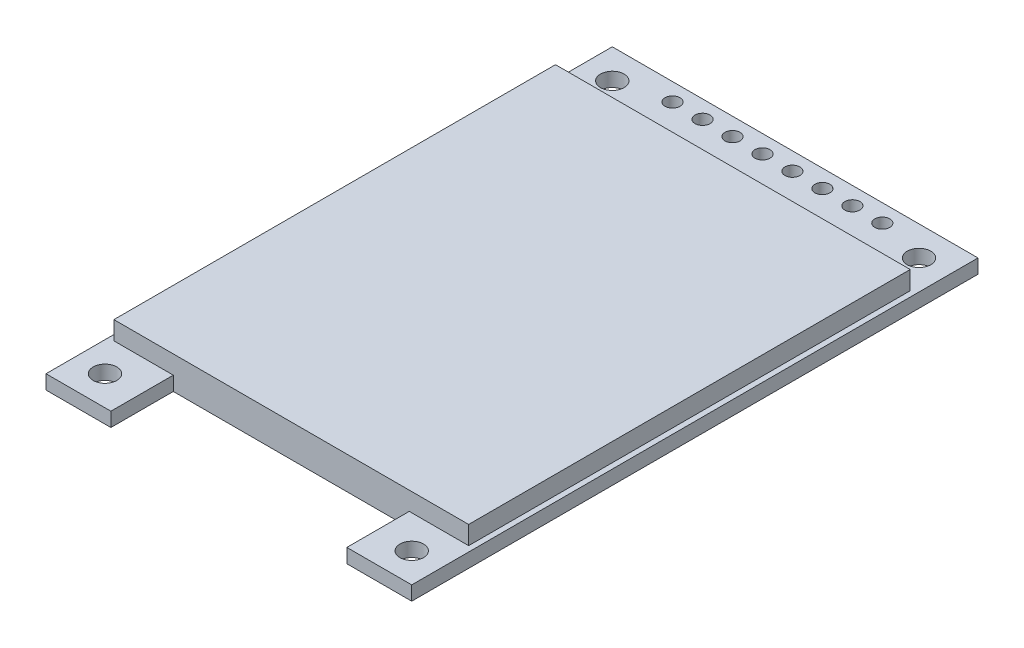
ISO-10303-21;
HEADER;
FILE_DESCRIPTION(('STEP AP214'),'2;1');
FILE_NAME('part.step','',(''),(''),'','','');
FILE_SCHEMA(('AUTOMOTIVE_DESIGN { 1 0 10303 214 1 1 1 1 }'));
ENDSEC;
DATA;
#1=APPLICATION_CONTEXT('core data for automotive mechanical design processes');
#2=APPLICATION_PROTOCOL_DEFINITION('international standard','automotive_design',2000,#1);
#3=PRODUCT_CONTEXT('',#1,'mechanical');
#4=PRODUCT('Part','Part','',(#3));
#5=PRODUCT_RELATED_PRODUCT_CATEGORY('part','',(#4));
#6=PRODUCT_DEFINITION_FORMATION('','',#4);
#7=PRODUCT_DEFINITION_CONTEXT('part definition',#1,'design');
#8=PRODUCT_DEFINITION('design','',#6,#7);
#9=PRODUCT_DEFINITION_SHAPE('','',#8);
#10=(LENGTH_UNIT() NAMED_UNIT(*) SI_UNIT(.MILLI.,.METRE.));
#11=(NAMED_UNIT(*) PLANE_ANGLE_UNIT() SI_UNIT($,.RADIAN.));
#12=(NAMED_UNIT(*) SI_UNIT($,.STERADIAN.) SOLID_ANGLE_UNIT());
#13=UNCERTAINTY_MEASURE_WITH_UNIT(LENGTH_MEASURE(1.E-05),#10,'distance_accuracy_value','');
#14=(GEOMETRIC_REPRESENTATION_CONTEXT(3) GLOBAL_UNCERTAINTY_ASSIGNED_CONTEXT((#13)) GLOBAL_UNIT_ASSIGNED_CONTEXT((#10,
#11,#12)) REPRESENTATION_CONTEXT('',''));
#15=CARTESIAN_POINT('',(0.,0.,0.));
#16=DIRECTION('',(0.,0.,1.));
#17=DIRECTION('',(1.,0.,0.));
#18=AXIS2_PLACEMENT_3D('',#15,#16,#17);
#19=CARTESIAN_POINT('',(0.,1.2,0.));
#20=DIRECTION('',(0.,0.,-1.));
#21=DIRECTION('',(-1.,0.,0.));
#22=AXIS2_PLACEMENT_3D('',#19,#20,#21);
#23=PLANE('',#22);
#24=DIRECTION('',(1.,0.,0.));
#25=VECTOR('',#24,1.);
#26=CARTESIAN_POINT('',(0.,0.,0.));
#27=LINE('',#26,#25);
#28=CARTESIAN_POINT('',(0.,0.,0.));
#29=VERTEX_POINT('',#28);
#30=CARTESIAN_POINT('',(5.5,0.,0.));
#31=VERTEX_POINT('',#30);
#32=EDGE_CURVE('E143',#29,#31,#27,.T.);
#33=ORIENTED_EDGE('',*,*,#32,.T.);
#34=DIRECTION('',(0.,1.,0.));
#35=VECTOR('',#34,1.);
#36=CARTESIAN_POINT('',(5.5,0.,0.));
#37=LINE('',#36,#35);
#38=CARTESIAN_POINT('',(5.5,1.2,0.));
#39=VERTEX_POINT('',#38);
#40=EDGE_CURVE('E126',#31,#39,#37,.T.);
#41=ORIENTED_EDGE('',*,*,#40,.T.);
#42=DIRECTION('',(1.,0.,0.));
#43=VECTOR('',#42,1.);
#44=CARTESIAN_POINT('',(0.,1.2,0.));
#45=LINE('',#44,#43);
#46=CARTESIAN_POINT('',(0.,1.2,0.));
#47=VERTEX_POINT('',#46);
#48=EDGE_CURVE('E251',#47,#39,#45,.T.);
#49=ORIENTED_EDGE('',*,*,#48,.F.);
#50=DIRECTION('',(0.,-1.,0.));
#51=VECTOR('',#50,1.);
#52=CARTESIAN_POINT('',(0.,1.2,0.));
#53=LINE('',#52,#51);
#54=EDGE_CURVE('E150',#47,#29,#53,.T.);
#55=ORIENTED_EDGE('',*,*,#54,.T.);
#56=EDGE_LOOP('',(#33,#41,#49,#55));
#57=FACE_BOUND('',#56,.T.);
#58=ADVANCED_FACE('F37',(#57),#23,.F.);
#59=CARTESIAN_POINT('',(24.39,0.,-46.5));
#60=DIRECTION('',(0.,1.,0.));
#61=DIRECTION('',(0.,0.,1.));
#62=AXIS2_PLACEMENT_3D('',#59,#60,#61);
#63=CYLINDRICAL_SURFACE('',#62,0.635000000000001);
#64=CARTESIAN_POINT('',(24.39,0.,-46.5));
#65=DIRECTION('',(0.,1.,0.));
#66=DIRECTION('',(0.,0.,1.));
#67=AXIS2_PLACEMENT_3D('',#64,#65,#66);
#68=CIRCLE('',#67,0.635000000000001);
#69=CARTESIAN_POINT('',(24.39,0.,-45.865));
#70=VERTEX_POINT('',#69);
#71=EDGE_CURVE('E45',#70,#70,#68,.T.);
#72=ORIENTED_EDGE('',*,*,#71,.F.);
#73=EDGE_LOOP('',(#72));
#74=FACE_BOUND('',#73,.T.);
#75=CARTESIAN_POINT('',(24.39,1.2,-46.5));
#76=DIRECTION('',(0.,1.,0.));
#77=DIRECTION('',(0.,0.,1.));
#78=AXIS2_PLACEMENT_3D('',#75,#76,#77);
#79=CIRCLE('',#78,0.635000000000001);
#80=CARTESIAN_POINT('',(24.39,1.2,-45.865));
#81=VERTEX_POINT('',#80);
#82=EDGE_CURVE('E11',#81,#81,#79,.T.);
#83=ORIENTED_EDGE('',*,*,#82,.T.);
#84=EDGE_LOOP('',(#83));
#85=FACE_BOUND('',#84,.T.);
#86=ADVANCED_FACE('F39',(#74,#85),#63,.F.);
#87=CARTESIAN_POINT('',(21.85,0.,-46.5));
#88=DIRECTION('',(0.,1.,0.));
#89=DIRECTION('',(0.,0.,1.));
#90=AXIS2_PLACEMENT_3D('',#87,#88,#89);
#91=CYLINDRICAL_SURFACE('',#90,0.635000000000001);
#92=CARTESIAN_POINT('',(21.85,0.,-46.5));
#93=DIRECTION('',(0.,1.,0.));
#94=DIRECTION('',(0.,0.,1.));
#95=AXIS2_PLACEMENT_3D('',#92,#93,#94);
#96=CIRCLE('',#95,0.635000000000001);
#97=CARTESIAN_POINT('',(21.85,0.,-45.865));
#98=VERTEX_POINT('',#97);
#99=EDGE_CURVE('E198',#98,#98,#96,.T.);
#100=ORIENTED_EDGE('',*,*,#99,.F.);
#101=EDGE_LOOP('',(#100));
#102=FACE_BOUND('',#101,.T.);
#103=CARTESIAN_POINT('',(21.85,1.2,-46.5));
#104=DIRECTION('',(0.,1.,0.));
#105=DIRECTION('',(0.,0.,1.));
#106=AXIS2_PLACEMENT_3D('',#103,#104,#105);
#107=CIRCLE('',#106,0.635000000000001);
#108=CARTESIAN_POINT('',(21.85,1.2,-45.865));
#109=VERTEX_POINT('',#108);
#110=EDGE_CURVE('E201',#109,#109,#107,.T.);
#111=ORIENTED_EDGE('',*,*,#110,.T.);
#112=EDGE_LOOP('',(#111));
#113=FACE_BOUND('',#112,.T.);
#114=ADVANCED_FACE('F209',(#102,#113),#91,.F.);
#115=CARTESIAN_POINT('',(19.31,0.,-46.5));
#116=DIRECTION('',(0.,1.,0.));
#117=DIRECTION('',(0.,0.,1.));
#118=AXIS2_PLACEMENT_3D('',#115,#116,#117);
#119=CYLINDRICAL_SURFACE('',#118,0.635000000000001);
#120=CARTESIAN_POINT('',(19.31,0.,-46.5));
#121=DIRECTION('',(0.,1.,0.));
#122=DIRECTION('',(0.,0.,1.));
#123=AXIS2_PLACEMENT_3D('',#120,#121,#122);
#124=CIRCLE('',#123,0.635000000000001);
#125=CARTESIAN_POINT('',(19.31,0.,-45.865));
#126=VERTEX_POINT('',#125);
#127=EDGE_CURVE('E192',#126,#126,#124,.T.);
#128=ORIENTED_EDGE('',*,*,#127,.F.);
#129=EDGE_LOOP('',(#128));
#130=FACE_BOUND('',#129,.T.);
#131=CARTESIAN_POINT('',(19.31,1.2,-46.5));
#132=DIRECTION('',(0.,1.,0.));
#133=DIRECTION('',(0.,0.,1.));
#134=AXIS2_PLACEMENT_3D('',#131,#132,#133);
#135=CIRCLE('',#134,0.635000000000001);
#136=CARTESIAN_POINT('',(19.31,1.2,-45.865));
#137=VERTEX_POINT('',#136);
#138=EDGE_CURVE('E195',#137,#137,#135,.T.);
#139=ORIENTED_EDGE('',*,*,#138,.T.);
#140=EDGE_LOOP('',(#139));
#141=FACE_BOUND('',#140,.T.);
#142=ADVANCED_FACE('F496',(#130,#141),#119,.F.);
#143=CARTESIAN_POINT('',(16.77,0.,-46.5));
#144=DIRECTION('',(0.,1.,0.));
#145=DIRECTION('',(0.,0.,1.));
#146=AXIS2_PLACEMENT_3D('',#143,#144,#145);
#147=CYLINDRICAL_SURFACE('',#146,0.635000000000001);
#148=CARTESIAN_POINT('',(16.77,0.,-46.5));
#149=DIRECTION('',(0.,1.,0.));
#150=DIRECTION('',(0.,0.,1.));
#151=AXIS2_PLACEMENT_3D('',#148,#149,#150);
#152=CIRCLE('',#151,0.635000000000001);
#153=CARTESIAN_POINT('',(16.77,0.,-45.865));
#154=VERTEX_POINT('',#153);
#155=EDGE_CURVE('E186',#154,#154,#152,.T.);
#156=ORIENTED_EDGE('',*,*,#155,.F.);
#157=EDGE_LOOP('',(#156));
#158=FACE_BOUND('',#157,.T.);
#159=CARTESIAN_POINT('',(16.77,1.2,-46.5));
#160=DIRECTION('',(0.,1.,0.));
#161=DIRECTION('',(0.,0.,1.));
#162=AXIS2_PLACEMENT_3D('',#159,#160,#161);
#163=CIRCLE('',#162,0.635000000000001);
#164=CARTESIAN_POINT('',(16.77,1.2,-45.865));
#165=VERTEX_POINT('',#164);
#166=EDGE_CURVE('E189',#165,#165,#163,.T.);
#167=ORIENTED_EDGE('',*,*,#166,.T.);
#168=EDGE_LOOP('',(#167));
#169=FACE_BOUND('',#168,.T.);
#170=ADVANCED_FACE('F487',(#158,#169),#147,.F.);
#171=CARTESIAN_POINT('',(14.23,0.,-46.5));
#172=DIRECTION('',(0.,1.,0.));
#173=DIRECTION('',(0.,0.,1.));
#174=AXIS2_PLACEMENT_3D('',#171,#172,#173);
#175=CYLINDRICAL_SURFACE('',#174,0.635000000000001);
#176=CARTESIAN_POINT('',(14.23,0.,-46.5));
#177=DIRECTION('',(0.,1.,0.));
#178=DIRECTION('',(0.,0.,1.));
#179=AXIS2_PLACEMENT_3D('',#176,#177,#178);
#180=CIRCLE('',#179,0.635000000000001);
#181=CARTESIAN_POINT('',(14.23,0.,-45.865));
#182=VERTEX_POINT('',#181);
#183=EDGE_CURVE('E180',#182,#182,#180,.T.);
#184=ORIENTED_EDGE('',*,*,#183,.F.);
#185=EDGE_LOOP('',(#184));
#186=FACE_BOUND('',#185,.T.);
#187=CARTESIAN_POINT('',(14.23,1.2,-46.5));
#188=DIRECTION('',(0.,1.,0.));
#189=DIRECTION('',(0.,0.,1.));
#190=AXIS2_PLACEMENT_3D('',#187,#188,#189);
#191=CIRCLE('',#190,0.635000000000001);
#192=CARTESIAN_POINT('',(14.23,1.2,-45.865));
#193=VERTEX_POINT('',#192);
#194=EDGE_CURVE('E183',#193,#193,#191,.T.);
#195=ORIENTED_EDGE('',*,*,#194,.T.);
#196=EDGE_LOOP('',(#195));
#197=FACE_BOUND('',#196,.T.);
#198=ADVANCED_FACE('F225',(#186,#197),#175,.F.);
#199=CARTESIAN_POINT('',(11.69,0.,-46.5));
#200=DIRECTION('',(0.,1.,0.));
#201=DIRECTION('',(0.,0.,1.));
#202=AXIS2_PLACEMENT_3D('',#199,#200,#201);
#203=CYLINDRICAL_SURFACE('',#202,0.635000000000001);
#204=CARTESIAN_POINT('',(11.69,0.,-46.5));
#205=DIRECTION('',(0.,1.,0.));
#206=DIRECTION('',(0.,0.,1.));
#207=AXIS2_PLACEMENT_3D('',#204,#205,#206);
#208=CIRCLE('',#207,0.635000000000001);
#209=CARTESIAN_POINT('',(11.69,0.,-45.865));
#210=VERTEX_POINT('',#209);
#211=EDGE_CURVE('E174',#210,#210,#208,.T.);
#212=ORIENTED_EDGE('',*,*,#211,.F.);
#213=EDGE_LOOP('',(#212));
#214=FACE_BOUND('',#213,.T.);
#215=CARTESIAN_POINT('',(11.69,1.2,-46.5));
#216=DIRECTION('',(0.,1.,0.));
#217=DIRECTION('',(0.,0.,1.));
#218=AXIS2_PLACEMENT_3D('',#215,#216,#217);
#219=CIRCLE('',#218,0.635000000000001);
#220=CARTESIAN_POINT('',(11.69,1.2,-45.865));
#221=VERTEX_POINT('',#220);
#222=EDGE_CURVE('E177',#221,#221,#219,.T.);
#223=ORIENTED_EDGE('',*,*,#222,.T.);
#224=EDGE_LOOP('',(#223));
#225=FACE_BOUND('',#224,.T.);
#226=ADVANCED_FACE('F215',(#214,#225),#203,.F.);
#227=CARTESIAN_POINT('',(0.,1.2,0.));
#228=DIRECTION('',(0.,-1.,0.));
#229=DIRECTION('',(0.,0.,-1.));
#230=AXIS2_PLACEMENT_3D('',#227,#228,#229);
#231=PLANE('',#230);
#232=CARTESIAN_POINT('',(28.5,1.2,-45.5));
#233=DIRECTION('',(0.,1.,0.));
#234=DIRECTION('',(0.,0.,1.));
#235=AXIS2_PLACEMENT_3D('',#232,#233,#234);
#236=CIRCLE('',#235,1.);
#237=CARTESIAN_POINT('',(28.5,1.2,-44.5));
#238=VERTEX_POINT('',#237);
#239=EDGE_CURVE('E324',#238,#238,#236,.T.);
#240=ORIENTED_EDGE('',*,*,#239,.F.);
#241=EDGE_LOOP('',(#240));
#242=FACE_BOUND('',#241,.T.);
#243=CARTESIAN_POINT('',(2.5,1.2,-2.5));
#244=DIRECTION('',(0.,1.,0.));
#245=DIRECTION('',(0.,0.,1.));
#246=AXIS2_PLACEMENT_3D('',#243,#244,#245);
#247=CIRCLE('',#246,1.);
#248=CARTESIAN_POINT('',(2.5,1.2,-1.5));
#249=VERTEX_POINT('',#248);
#250=EDGE_CURVE('E317',#249,#249,#247,.T.);
#251=ORIENTED_EDGE('',*,*,#250,.F.);
#252=EDGE_LOOP('',(#251));
#253=FACE_BOUND('',#252,.T.);
#254=CARTESIAN_POINT('',(28.5,1.2,-2.5));
#255=DIRECTION('',(0.,1.,0.));
#256=DIRECTION('',(0.,0.,1.));
#257=AXIS2_PLACEMENT_3D('',#254,#255,#256);
#258=CIRCLE('',#257,1.);
#259=CARTESIAN_POINT('',(28.5,1.2,-1.5));
#260=VERTEX_POINT('',#259);
#261=EDGE_CURVE('E334',#260,#260,#258,.T.);
#262=ORIENTED_EDGE('',*,*,#261,.F.);
#263=EDGE_LOOP('',(#262));
#264=FACE_BOUND('',#263,.T.);
#265=CARTESIAN_POINT('',(2.5,1.2,-45.5));
#266=DIRECTION('',(0.,1.,0.));
#267=DIRECTION('',(0.,0.,1.));
#268=AXIS2_PLACEMENT_3D('',#265,#266,#267);
#269=CIRCLE('',#268,1.);
#270=CARTESIAN_POINT('',(2.5,1.2,-44.5));
#271=VERTEX_POINT('',#270);
#272=EDGE_CURVE('E311',#271,#271,#269,.T.);
#273=ORIENTED_EDGE('',*,*,#272,.F.);
#274=EDGE_LOOP('',(#273));
#275=FACE_BOUND('',#274,.T.);
#276=CARTESIAN_POINT('',(9.15,1.2,-46.5));
#277=DIRECTION('',(0.,1.,0.));
#278=DIRECTION('',(0.,0.,1.));
#279=AXIS2_PLACEMENT_3D('',#276,#277,#278);
#280=CIRCLE('',#279,0.635000000000001);
#281=CARTESIAN_POINT('',(9.15,1.2,-45.865));
#282=VERTEX_POINT('',#281);
#283=EDGE_CURVE('E302',#282,#282,#280,.T.);
#284=ORIENTED_EDGE('',*,*,#283,.F.);
#285=EDGE_LOOP('',(#284));
#286=FACE_BOUND('',#285,.T.);
#287=CARTESIAN_POINT('',(6.61,1.2,-46.5));
#288=DIRECTION('',(0.,1.,0.));
#289=DIRECTION('',(0.,0.,1.));
#290=AXIS2_PLACEMENT_3D('',#287,#288,#289);
#291=CIRCLE('',#290,0.635000000000001);
#292=CARTESIAN_POINT('',(6.61,1.2,-45.865));
#293=VERTEX_POINT('',#292);
#294=EDGE_CURVE('E299',#293,#293,#291,.T.);
#295=ORIENTED_EDGE('',*,*,#294,.F.);
#296=EDGE_LOOP('',(#295));
#297=FACE_BOUND('',#296,.T.);
#298=ORIENTED_EDGE('',*,*,#48,.T.);
#299=DIRECTION('',(0.,0.,1.));
#300=VECTOR('',#299,1.);
#301=CARTESIAN_POINT('',(5.5,1.2,0.));
#302=LINE('',#301,#300);
#303=CARTESIAN_POINT('',(5.5,1.2,-5.29));
#304=VERTEX_POINT('',#303);
#305=EDGE_CURVE('E132',#304,#39,#302,.T.);
#306=ORIENTED_EDGE('',*,*,#305,.F.);
#307=DIRECTION('',(1.,0.,0.));
#308=VECTOR('',#307,1.);
#309=CARTESIAN_POINT('',(0.465000000000005,1.2,-5.29));
#310=LINE('',#309,#308);
#311=CARTESIAN_POINT('',(0.465000000000005,1.2,-5.29));
#312=VERTEX_POINT('',#311);
#313=EDGE_CURVE('E287',#312,#304,#310,.T.);
#314=ORIENTED_EDGE('',*,*,#313,.F.);
#315=DIRECTION('',(0.,0.,1.));
#316=VECTOR('',#315,1.);
#317=CARTESIAN_POINT('',(0.465000000000001,1.2,-42.72));
#318=LINE('',#317,#316);
#319=CARTESIAN_POINT('',(0.465000000000001,1.2,-42.72));
#320=VERTEX_POINT('',#319);
#321=EDGE_CURVE('E60',#320,#312,#318,.T.);
#322=ORIENTED_EDGE('',*,*,#321,.F.);
#323=DIRECTION('',(-1.,0.,0.));
#324=VECTOR('',#323,1.);
#325=CARTESIAN_POINT('',(0.465000000000001,1.2,-42.72));
#326=LINE('',#325,#324);
#327=CARTESIAN_POINT('',(30.535,1.2,-42.72));
#328=VERTEX_POINT('',#327);
#329=EDGE_CURVE('E281',#328,#320,#326,.T.);
#330=ORIENTED_EDGE('',*,*,#329,.F.);
#331=DIRECTION('',(0.,0.,-1.));
#332=VECTOR('',#331,1.);
#333=CARTESIAN_POINT('',(30.535,1.2,-42.72));
#334=LINE('',#333,#332);
#335=CARTESIAN_POINT('',(30.535,1.2,-5.29000000000001));
#336=VERTEX_POINT('',#335);
#337=EDGE_CURVE('E284',#336,#328,#334,.T.);
#338=ORIENTED_EDGE('',*,*,#337,.F.);
#339=CARTESIAN_POINT('',(25.5,1.2,-5.29000000000001));
#340=VERTEX_POINT('',#339);
#341=EDGE_CURVE('E289',#340,#336,#310,.T.);
#342=ORIENTED_EDGE('',*,*,#341,.F.);
#343=DIRECTION('',(0.,0.,-1.));
#344=VECTOR('',#343,1.);
#345=CARTESIAN_POINT('',(25.5,1.2,0.));
#346=LINE('',#345,#344);
#347=CARTESIAN_POINT('',(25.5,1.2,0.));
#348=VERTEX_POINT('',#347);
#349=EDGE_CURVE('E52',#348,#340,#346,.T.);
#350=ORIENTED_EDGE('',*,*,#349,.F.);
#351=CARTESIAN_POINT('',(31.,1.2,0.));
#352=VERTEX_POINT('',#351);
#353=EDGE_CURVE('E248',#348,#352,#45,.T.);
#354=ORIENTED_EDGE('',*,*,#353,.T.);
#355=DIRECTION('',(0.,0.,-1.));
#356=VECTOR('',#355,1.);
#357=CARTESIAN_POINT('',(31.,1.2,0.));
#358=LINE('',#357,#356);
#359=CARTESIAN_POINT('',(31.,1.2,-48.));
#360=VERTEX_POINT('',#359);
#361=EDGE_CURVE('E253',#352,#360,#358,.T.);
#362=ORIENTED_EDGE('',*,*,#361,.T.);
#363=DIRECTION('',(-1.,0.,0.));
#364=VECTOR('',#363,1.);
#365=CARTESIAN_POINT('',(0.,1.2,-48.));
#366=LINE('',#365,#364);
#367=CARTESIAN_POINT('',(0.,1.2,-48.));
#368=VERTEX_POINT('',#367);
#369=EDGE_CURVE('E167',#360,#368,#366,.T.);
#370=ORIENTED_EDGE('',*,*,#369,.T.);
#371=DIRECTION('',(0.,0.,1.));
#372=VECTOR('',#371,1.);
#373=CARTESIAN_POINT('',(0.,1.2,0.));
#374=LINE('',#373,#372);
#375=EDGE_CURVE('E162',#368,#47,#374,.T.);
#376=ORIENTED_EDGE('',*,*,#375,.T.);
#377=EDGE_LOOP('',(#298,#306,#314,#322,#330,#338,#342,#350,#354,#362,#370,#376));
#378=FACE_BOUND('',#377,.T.);
#379=ORIENTED_EDGE('',*,*,#222,.F.);
#380=EDGE_LOOP('',(#379));
#381=FACE_BOUND('',#380,.T.);
#382=ORIENTED_EDGE('',*,*,#194,.F.);
#383=EDGE_LOOP('',(#382));
#384=FACE_BOUND('',#383,.T.);
#385=ORIENTED_EDGE('',*,*,#166,.F.);
#386=EDGE_LOOP('',(#385));
#387=FACE_BOUND('',#386,.T.);
#388=ORIENTED_EDGE('',*,*,#138,.F.);
#389=EDGE_LOOP('',(#388));
#390=FACE_BOUND('',#389,.T.);
#391=ORIENTED_EDGE('',*,*,#110,.F.);
#392=EDGE_LOOP('',(#391));
#393=FACE_BOUND('',#392,.T.);
#394=ORIENTED_EDGE('',*,*,#82,.F.);
#395=EDGE_LOOP('',(#394));
#396=FACE_BOUND('',#395,.T.);
#397=ADVANCED_FACE('F212',(#242,#253,#264,#275,#286,#297,#378,#381,#384,#387,#390,#393,#396),
#231,.F.);
#398=CARTESIAN_POINT('',(0.,1.2,0.));
#399=DIRECTION('',(1.,0.,0.));
#400=DIRECTION('',(0.,0.,-1.));
#401=AXIS2_PLACEMENT_3D('',#398,#399,#400);
#402=PLANE('',#401);
#403=DIRECTION('',(0.,0.,1.));
#404=VECTOR('',#403,1.);
#405=CARTESIAN_POINT('',(0.,0.,0.));
#406=LINE('',#405,#404);
#407=CARTESIAN_POINT('',(0.,0.,-48.));
#408=VERTEX_POINT('',#407);
#409=EDGE_CURVE('E157',#408,#29,#406,.T.);
#410=ORIENTED_EDGE('',*,*,#409,.T.);
#411=ORIENTED_EDGE('',*,*,#54,.F.);
#412=ORIENTED_EDGE('',*,*,#375,.F.);
#413=DIRECTION('',(0.,-1.,0.));
#414=VECTOR('',#413,1.);
#415=CARTESIAN_POINT('',(0.,1.2,-48.));
#416=LINE('',#415,#414);
#417=EDGE_CURVE('E163',#368,#408,#416,.T.);
#418=ORIENTED_EDGE('',*,*,#417,.T.);
#419=EDGE_LOOP('',(#410,#411,#412,#418));
#420=FACE_BOUND('',#419,.T.);
#421=ADVANCED_FACE('F214',(#420),#402,.F.);
#422=ORIENTED_EDGE('',*,*,#353,.F.);
#423=DIRECTION('',(0.,1.,0.));
#424=VECTOR('',#423,1.);
#425=CARTESIAN_POINT('',(25.5,0.,0.));
#426=LINE('',#425,#424);
#427=CARTESIAN_POINT('',(25.5,0.,0.));
#428=VERTEX_POINT('',#427);
#429=EDGE_CURVE('E136',#428,#348,#426,.T.);
#430=ORIENTED_EDGE('',*,*,#429,.F.);
#431=CARTESIAN_POINT('',(31.,0.,0.));
#432=VERTEX_POINT('',#431);
#433=EDGE_CURVE('E153',#428,#432,#27,.T.);
#434=ORIENTED_EDGE('',*,*,#433,.T.);
#435=DIRECTION('',(0.,-1.,0.));
#436=VECTOR('',#435,1.);
#437=CARTESIAN_POINT('',(31.,1.2,0.));
#438=LINE('',#437,#436);
#439=EDGE_CURVE('E170',#352,#432,#438,.T.);
#440=ORIENTED_EDGE('',*,*,#439,.F.);
#441=EDGE_LOOP('',(#422,#430,#434,#440));
#442=FACE_BOUND('',#441,.T.);
#443=ADVANCED_FACE('F222',(#442),#23,.F.);
#444=CARTESIAN_POINT('',(31.,1.2,0.));
#445=DIRECTION('',(-1.,0.,0.));
#446=DIRECTION('',(0.,0.,1.));
#447=AXIS2_PLACEMENT_3D('',#444,#445,#446);
#448=PLANE('',#447);
#449=DIRECTION('',(0.,0.,-1.));
#450=VECTOR('',#449,1.);
#451=CARTESIAN_POINT('',(31.,0.,0.));
#452=LINE('',#451,#450);
#453=CARTESIAN_POINT('',(31.,0.,-48.));
#454=VERTEX_POINT('',#453);
#455=EDGE_CURVE('E152',#432,#454,#452,.T.);
#456=ORIENTED_EDGE('',*,*,#455,.T.);
#457=DIRECTION('',(0.,-1.,0.));
#458=VECTOR('',#457,1.);
#459=CARTESIAN_POINT('',(31.,1.2,-48.));
#460=LINE('',#459,#458);
#461=EDGE_CURVE('E166',#360,#454,#460,.T.);
#462=ORIENTED_EDGE('',*,*,#461,.F.);
#463=ORIENTED_EDGE('',*,*,#361,.F.);
#464=ORIENTED_EDGE('',*,*,#439,.T.);
#465=EDGE_LOOP('',(#456,#462,#463,#464));
#466=FACE_BOUND('',#465,.T.);
#467=ADVANCED_FACE('F238',(#466),#448,.F.);
#468=CARTESIAN_POINT('',(0.,1.2,-48.));
#469=DIRECTION('',(0.,0.,1.));
#470=DIRECTION('',(1.,0.,0.));
#471=AXIS2_PLACEMENT_3D('',#468,#469,#470);
#472=PLANE('',#471);
#473=DIRECTION('',(-1.,0.,0.));
#474=VECTOR('',#473,1.);
#475=CARTESIAN_POINT('',(0.,0.,-48.));
#476=LINE('',#475,#474);
#477=EDGE_CURVE('E155',#454,#408,#476,.T.);
#478=ORIENTED_EDGE('',*,*,#477,.T.);
#479=ORIENTED_EDGE('',*,*,#417,.F.);
#480=ORIENTED_EDGE('',*,*,#369,.F.);
#481=ORIENTED_EDGE('',*,*,#461,.T.);
#482=EDGE_LOOP('',(#478,#479,#480,#481));
#483=FACE_BOUND('',#482,.T.);
#484=ADVANCED_FACE('F243',(#483),#472,.F.);
#485=CARTESIAN_POINT('',(0.,0.,0.));
#486=DIRECTION('',(0.,-1.,0.));
#487=DIRECTION('',(0.,0.,-1.));
#488=AXIS2_PLACEMENT_3D('',#485,#486,#487);
#489=PLANE('',#488);
#490=CARTESIAN_POINT('',(28.5,0.,-45.5));
#491=DIRECTION('',(0.,1.,0.));
#492=DIRECTION('',(0.,0.,1.));
#493=AXIS2_PLACEMENT_3D('',#490,#491,#492);
#494=CIRCLE('',#493,1.);
#495=CARTESIAN_POINT('',(28.5,0.,-44.5));
#496=VERTEX_POINT('',#495);
#497=EDGE_CURVE('E314',#496,#496,#494,.T.);
#498=ORIENTED_EDGE('',*,*,#497,.T.);
#499=EDGE_LOOP('',(#498));
#500=FACE_BOUND('',#499,.T.);
#501=CARTESIAN_POINT('',(2.5,0.,-2.5));
#502=DIRECTION('',(0.,1.,0.));
#503=DIRECTION('',(0.,0.,1.));
#504=AXIS2_PLACEMENT_3D('',#501,#502,#503);
#505=CIRCLE('',#504,1.);
#506=CARTESIAN_POINT('',(2.5,0.,-1.5));
#507=VERTEX_POINT('',#506);
#508=EDGE_CURVE('E320',#507,#507,#505,.T.);
#509=ORIENTED_EDGE('',*,*,#508,.T.);
#510=EDGE_LOOP('',(#509));
#511=FACE_BOUND('',#510,.T.);
#512=CARTESIAN_POINT('',(28.5,0.,-2.5));
#513=DIRECTION('',(0.,1.,0.));
#514=DIRECTION('',(0.,0.,1.));
#515=AXIS2_PLACEMENT_3D('',#512,#513,#514);
#516=CIRCLE('',#515,1.);
#517=CARTESIAN_POINT('',(28.5,0.,-1.5));
#518=VERTEX_POINT('',#517);
#519=EDGE_CURVE('E321',#518,#518,#516,.T.);
#520=ORIENTED_EDGE('',*,*,#519,.T.);
#521=EDGE_LOOP('',(#520));
#522=FACE_BOUND('',#521,.T.);
#523=DIRECTION('',(0.,0.,1.));
#524=VECTOR('',#523,1.);
#525=CARTESIAN_POINT('',(5.5,0.,0.));
#526=LINE('',#525,#524);
#527=CARTESIAN_POINT('',(5.5,0.,-5.29));
#528=VERTEX_POINT('',#527);
#529=EDGE_CURVE('E129',#528,#31,#526,.T.);
#530=ORIENTED_EDGE('',*,*,#529,.T.);
#531=ORIENTED_EDGE('',*,*,#32,.F.);
#532=ORIENTED_EDGE('',*,*,#409,.F.);
#533=ORIENTED_EDGE('',*,*,#477,.F.);
#534=ORIENTED_EDGE('',*,*,#455,.F.);
#535=ORIENTED_EDGE('',*,*,#433,.F.);
#536=DIRECTION('',(0.,0.,-1.));
#537=VECTOR('',#536,1.);
#538=CARTESIAN_POINT('',(25.5,0.,0.));
#539=LINE('',#538,#537);
#540=CARTESIAN_POINT('',(25.5,0.,-5.29));
#541=VERTEX_POINT('',#540);
#542=EDGE_CURVE('E147',#428,#541,#539,.T.);
#543=ORIENTED_EDGE('',*,*,#542,.T.);
#544=DIRECTION('',(-1.,0.,0.));
#545=VECTOR('',#544,1.);
#546=CARTESIAN_POINT('',(5.5,0.,-5.29));
#547=LINE('',#546,#545);
#548=EDGE_CURVE('E137',#541,#528,#547,.T.);
#549=ORIENTED_EDGE('',*,*,#548,.T.);
#550=EDGE_LOOP('',(#530,#531,#532,#533,#534,#535,#543,#549));
#551=FACE_BOUND('',#550,.T.);
#552=CARTESIAN_POINT('',(2.5,0.,-45.5));
#553=DIRECTION('',(0.,1.,0.));
#554=DIRECTION('',(0.,0.,1.));
#555=AXIS2_PLACEMENT_3D('',#552,#553,#554);
#556=CIRCLE('',#555,1.);
#557=CARTESIAN_POINT('',(2.5,0.,-44.5));
#558=VERTEX_POINT('',#557);
#559=EDGE_CURVE('E310',#558,#558,#556,.T.);
#560=ORIENTED_EDGE('',*,*,#559,.T.);
#561=EDGE_LOOP('',(#560));
#562=FACE_BOUND('',#561,.T.);
#563=CARTESIAN_POINT('',(9.15,0.,-46.5));
#564=DIRECTION('',(0.,1.,0.));
#565=DIRECTION('',(0.,0.,1.));
#566=AXIS2_PLACEMENT_3D('',#563,#564,#565);
#567=CIRCLE('',#566,0.635000000000001);
#568=CARTESIAN_POINT('',(9.15,0.,-45.865));
#569=VERTEX_POINT('',#568);
#570=EDGE_CURVE('E307',#569,#569,#567,.T.);
#571=ORIENTED_EDGE('',*,*,#570,.T.);
#572=EDGE_LOOP('',(#571));
#573=FACE_BOUND('',#572,.T.);
#574=CARTESIAN_POINT('',(6.61,0.,-46.5));
#575=DIRECTION('',(0.,1.,0.));
#576=DIRECTION('',(0.,0.,1.));
#577=AXIS2_PLACEMENT_3D('',#574,#575,#576);
#578=CIRCLE('',#577,0.635000000000001);
#579=CARTESIAN_POINT('',(6.61,0.,-45.865));
#580=VERTEX_POINT('',#579);
#581=EDGE_CURVE('E291',#580,#580,#578,.T.);
#582=ORIENTED_EDGE('',*,*,#581,.T.);
#583=EDGE_LOOP('',(#582));
#584=FACE_BOUND('',#583,.T.);
#585=ORIENTED_EDGE('',*,*,#211,.T.);
#586=EDGE_LOOP('',(#585));
#587=FACE_BOUND('',#586,.T.);
#588=ORIENTED_EDGE('',*,*,#183,.T.);
#589=EDGE_LOOP('',(#588));
#590=FACE_BOUND('',#589,.T.);
#591=ORIENTED_EDGE('',*,*,#155,.T.);
#592=EDGE_LOOP('',(#591));
#593=FACE_BOUND('',#592,.T.);
#594=ORIENTED_EDGE('',*,*,#127,.T.);
#595=EDGE_LOOP('',(#594));
#596=FACE_BOUND('',#595,.T.);
#597=ORIENTED_EDGE('',*,*,#99,.T.);
#598=EDGE_LOOP('',(#597));
#599=FACE_BOUND('',#598,.T.);
#600=ORIENTED_EDGE('',*,*,#71,.T.);
#601=EDGE_LOOP('',(#600));
#602=FACE_BOUND('',#601,.T.);
#603=ADVANCED_FACE('F140',(#500,#511,#522,#551,#562,#573,#584,#587,#590,#593,#596,#599,#602),
#489,.T.);
#604=CARTESIAN_POINT('',(0.465000000000001,2.76,-42.72));
#605=DIRECTION('',(1.,0.,0.));
#606=DIRECTION('',(0.,0.,-1.));
#607=AXIS2_PLACEMENT_3D('',#604,#605,#606);
#608=PLANE('',#607);
#609=ORIENTED_EDGE('',*,*,#321,.T.);
#610=DIRECTION('',(0.,-1.,0.));
#611=VECTOR('',#610,1.);
#612=CARTESIAN_POINT('',(0.465000000000005,2.76,-5.29));
#613=LINE('',#612,#611);
#614=CARTESIAN_POINT('',(0.465000000000005,2.76,-5.29));
#615=VERTEX_POINT('',#614);
#616=EDGE_CURVE('E265',#615,#312,#613,.T.);
#617=ORIENTED_EDGE('',*,*,#616,.F.);
#618=DIRECTION('',(0.,0.,1.));
#619=VECTOR('',#618,1.);
#620=CARTESIAN_POINT('',(0.465000000000001,2.76,-42.72));
#621=LINE('',#620,#619);
#622=CARTESIAN_POINT('',(0.465000000000001,2.76,-42.72));
#623=VERTEX_POINT('',#622);
#624=EDGE_CURVE('E283',#623,#615,#621,.T.);
#625=ORIENTED_EDGE('',*,*,#624,.F.);
#626=DIRECTION('',(0.,-1.,0.));
#627=VECTOR('',#626,1.);
#628=CARTESIAN_POINT('',(0.465000000000001,2.76,-42.72));
#629=LINE('',#628,#627);
#630=EDGE_CURVE('E277',#623,#320,#629,.T.);
#631=ORIENTED_EDGE('',*,*,#630,.T.);
#632=EDGE_LOOP('',(#609,#617,#625,#631));
#633=FACE_BOUND('',#632,.T.);
#634=ADVANCED_FACE('F387',(#633),#608,.F.);
#635=CARTESIAN_POINT('',(0.465000000000005,2.76,-5.29));
#636=DIRECTION('',(0.,0.,-1.));
#637=DIRECTION('',(-1.,0.,0.));
#638=AXIS2_PLACEMENT_3D('',#635,#636,#637);
#639=PLANE('',#638);
#640=ORIENTED_EDGE('',*,*,#313,.T.);
#641=DIRECTION('',(0.,1.,0.));
#642=VECTOR('',#641,1.);
#643=CARTESIAN_POINT('',(5.5,0.,-5.29));
#644=LINE('',#643,#642);
#645=EDGE_CURVE('E332',#528,#304,#644,.T.);
#646=ORIENTED_EDGE('',*,*,#645,.F.);
#647=ORIENTED_EDGE('',*,*,#548,.F.);
#648=DIRECTION('',(0.,1.,0.));
#649=VECTOR('',#648,1.);
#650=CARTESIAN_POINT('',(25.5,0.,-5.29));
#651=LINE('',#650,#649);
#652=EDGE_CURVE('E330',#541,#340,#651,.T.);
#653=ORIENTED_EDGE('',*,*,#652,.T.);
#654=ORIENTED_EDGE('',*,*,#341,.T.);
#655=DIRECTION('',(0.,-1.,0.));
#656=VECTOR('',#655,1.);
#657=CARTESIAN_POINT('',(30.535,2.76,-5.29000000000001));
#658=LINE('',#657,#656);
#659=CARTESIAN_POINT('',(30.535,2.76,-5.29000000000001));
#660=VERTEX_POINT('',#659);
#661=EDGE_CURVE('E267',#660,#336,#658,.T.);
#662=ORIENTED_EDGE('',*,*,#661,.F.);
#663=DIRECTION('',(1.,0.,0.));
#664=VECTOR('',#663,1.);
#665=CARTESIAN_POINT('',(0.465000000000005,2.76,-5.29));
#666=LINE('',#665,#664);
#667=EDGE_CURVE('E295',#615,#660,#666,.T.);
#668=ORIENTED_EDGE('',*,*,#667,.F.);
#669=ORIENTED_EDGE('',*,*,#616,.T.);
#670=EDGE_LOOP('',(#640,#646,#647,#653,#654,#662,#668,#669));
#671=FACE_BOUND('',#670,.T.);
#672=ADVANCED_FACE('F384',(#671),#639,.F.);
#673=CARTESIAN_POINT('',(30.535,2.76,-42.72));
#674=DIRECTION('',(-1.,0.,0.));
#675=DIRECTION('',(0.,0.,1.));
#676=AXIS2_PLACEMENT_3D('',#673,#674,#675);
#677=PLANE('',#676);
#678=ORIENTED_EDGE('',*,*,#337,.T.);
#679=DIRECTION('',(0.,-1.,0.));
#680=VECTOR('',#679,1.);
#681=CARTESIAN_POINT('',(30.535,2.76,-42.72));
#682=LINE('',#681,#680);
#683=CARTESIAN_POINT('',(30.535,2.76,-42.72));
#684=VERTEX_POINT('',#683);
#685=EDGE_CURVE('E272',#684,#328,#682,.T.);
#686=ORIENTED_EDGE('',*,*,#685,.F.);
#687=DIRECTION('',(0.,0.,-1.));
#688=VECTOR('',#687,1.);
#689=CARTESIAN_POINT('',(30.535,2.76,-42.72));
#690=LINE('',#689,#688);
#691=EDGE_CURVE('E293',#660,#684,#690,.T.);
#692=ORIENTED_EDGE('',*,*,#691,.F.);
#693=ORIENTED_EDGE('',*,*,#661,.T.);
#694=EDGE_LOOP('',(#678,#686,#692,#693));
#695=FACE_BOUND('',#694,.T.);
#696=ADVANCED_FACE('F380',(#695),#677,.F.);
#697=CARTESIAN_POINT('',(0.465000000000001,2.76,-42.72));
#698=DIRECTION('',(0.,0.,1.));
#699=DIRECTION('',(1.,0.,0.));
#700=AXIS2_PLACEMENT_3D('',#697,#698,#699);
#701=PLANE('',#700);
#702=ORIENTED_EDGE('',*,*,#329,.T.);
#703=ORIENTED_EDGE('',*,*,#630,.F.);
#704=DIRECTION('',(-1.,0.,0.));
#705=VECTOR('',#704,1.);
#706=CARTESIAN_POINT('',(0.465000000000001,2.76,-42.72));
#707=LINE('',#706,#705);
#708=EDGE_CURVE('E280',#684,#623,#707,.T.);
#709=ORIENTED_EDGE('',*,*,#708,.F.);
#710=ORIENTED_EDGE('',*,*,#685,.T.);
#711=EDGE_LOOP('',(#702,#703,#709,#710));
#712=FACE_BOUND('',#711,.T.);
#713=ADVANCED_FACE('F372',(#712),#701,.F.);
#714=CARTESIAN_POINT('',(0.,2.76,0.));
#715=DIRECTION('',(0.,1.,0.));
#716=DIRECTION('',(0.,0.,1.));
#717=AXIS2_PLACEMENT_3D('',#714,#715,#716);
#718=PLANE('',#717);
#719=ORIENTED_EDGE('',*,*,#624,.T.);
#720=ORIENTED_EDGE('',*,*,#667,.T.);
#721=ORIENTED_EDGE('',*,*,#691,.T.);
#722=ORIENTED_EDGE('',*,*,#708,.T.);
#723=EDGE_LOOP('',(#719,#720,#721,#722));
#724=FACE_BOUND('',#723,.T.);
#725=ADVANCED_FACE('F363',(#724),#718,.T.);
#726=CARTESIAN_POINT('',(6.61,0.,-46.5));
#727=DIRECTION('',(0.,1.,0.));
#728=DIRECTION('',(0.,0.,1.));
#729=AXIS2_PLACEMENT_3D('',#726,#727,#728);
#730=CYLINDRICAL_SURFACE('',#729,0.635000000000001);
#731=ORIENTED_EDGE('',*,*,#581,.F.);
#732=EDGE_LOOP('',(#731));
#733=FACE_BOUND('',#732,.T.);
#734=ORIENTED_EDGE('',*,*,#294,.T.);
#735=EDGE_LOOP('',(#734));
#736=FACE_BOUND('',#735,.T.);
#737=ADVANCED_FACE('F360',(#733,#736),#730,.F.);
#738=CARTESIAN_POINT('',(9.15,0.,-46.5));
#739=DIRECTION('',(0.,1.,0.));
#740=DIRECTION('',(0.,0.,1.));
#741=AXIS2_PLACEMENT_3D('',#738,#739,#740);
#742=CYLINDRICAL_SURFACE('',#741,0.635000000000001);
#743=ORIENTED_EDGE('',*,*,#570,.F.);
#744=EDGE_LOOP('',(#743));
#745=FACE_BOUND('',#744,.T.);
#746=ORIENTED_EDGE('',*,*,#283,.T.);
#747=EDGE_LOOP('',(#746));
#748=FACE_BOUND('',#747,.T.);
#749=ADVANCED_FACE('F362',(#745,#748),#742,.F.);
#750=CARTESIAN_POINT('',(5.5,0.,0.));
#751=DIRECTION('',(-1.,0.,0.));
#752=DIRECTION('',(0.,0.,1.));
#753=AXIS2_PLACEMENT_3D('',#750,#751,#752);
#754=PLANE('',#753);
#755=ORIENTED_EDGE('',*,*,#305,.T.);
#756=ORIENTED_EDGE('',*,*,#40,.F.);
#757=ORIENTED_EDGE('',*,*,#529,.F.);
#758=ORIENTED_EDGE('',*,*,#645,.T.);
#759=EDGE_LOOP('',(#755,#756,#757,#758));
#760=FACE_BOUND('',#759,.T.);
#761=ADVANCED_FACE('F128',(#760),#754,.F.);
#762=CARTESIAN_POINT('',(25.5,0.,0.));
#763=DIRECTION('',(1.,0.,0.));
#764=DIRECTION('',(0.,0.,-1.));
#765=AXIS2_PLACEMENT_3D('',#762,#763,#764);
#766=PLANE('',#765);
#767=ORIENTED_EDGE('',*,*,#349,.T.);
#768=ORIENTED_EDGE('',*,*,#652,.F.);
#769=ORIENTED_EDGE('',*,*,#542,.F.);
#770=ORIENTED_EDGE('',*,*,#429,.T.);
#771=EDGE_LOOP('',(#767,#768,#769,#770));
#772=FACE_BOUND('',#771,.T.);
#773=ADVANCED_FACE('F402',(#772),#766,.F.);
#774=CARTESIAN_POINT('',(2.5,0.,-45.5));
#775=DIRECTION('',(0.,1.,0.));
#776=DIRECTION('',(0.,0.,1.));
#777=AXIS2_PLACEMENT_3D('',#774,#775,#776);
#778=CYLINDRICAL_SURFACE('',#777,1.);
#779=ORIENTED_EDGE('',*,*,#559,.F.);
#780=EDGE_LOOP('',(#779));
#781=FACE_BOUND('',#780,.T.);
#782=ORIENTED_EDGE('',*,*,#272,.T.);
#783=EDGE_LOOP('',(#782));
#784=FACE_BOUND('',#783,.T.);
#785=ADVANCED_FACE('F349',(#781,#784),#778,.F.);
#786=CARTESIAN_POINT('',(28.5,0.,-2.5));
#787=DIRECTION('',(0.,1.,0.));
#788=DIRECTION('',(0.,0.,1.));
#789=AXIS2_PLACEMENT_3D('',#786,#787,#788);
#790=CYLINDRICAL_SURFACE('',#789,1.);
#791=ORIENTED_EDGE('',*,*,#519,.F.);
#792=EDGE_LOOP('',(#791));
#793=FACE_BOUND('',#792,.T.);
#794=ORIENTED_EDGE('',*,*,#261,.T.);
#795=EDGE_LOOP('',(#794));
#796=FACE_BOUND('',#795,.T.);
#797=ADVANCED_FACE('F345',(#793,#796),#790,.F.);
#798=CARTESIAN_POINT('',(2.5,0.,-2.5));
#799=DIRECTION('',(0.,1.,0.));
#800=DIRECTION('',(0.,0.,1.));
#801=AXIS2_PLACEMENT_3D('',#798,#799,#800);
#802=CYLINDRICAL_SURFACE('',#801,1.);
#803=ORIENTED_EDGE('',*,*,#508,.F.);
#804=EDGE_LOOP('',(#803));
#805=FACE_BOUND('',#804,.T.);
#806=ORIENTED_EDGE('',*,*,#250,.T.);
#807=EDGE_LOOP('',(#806));
#808=FACE_BOUND('',#807,.T.);
#809=ADVANCED_FACE('F348',(#805,#808),#802,.F.);
#810=CARTESIAN_POINT('',(28.5,0.,-45.5));
#811=DIRECTION('',(0.,1.,0.));
#812=DIRECTION('',(0.,0.,1.));
#813=AXIS2_PLACEMENT_3D('',#810,#811,#812);
#814=CYLINDRICAL_SURFACE('',#813,1.);
#815=ORIENTED_EDGE('',*,*,#497,.F.);
#816=EDGE_LOOP('',(#815));
#817=FACE_BOUND('',#816,.T.);
#818=ORIENTED_EDGE('',*,*,#239,.T.);
#819=EDGE_LOOP('',(#818));
#820=FACE_BOUND('',#819,.T.);
#821=ADVANCED_FACE('F413',(#817,#820),#814,.F.);
#822=CLOSED_SHELL('',(#58,#86,#114,#142,#170,#198,#226,#397,#421,#443,#467,#484,#603,#634,#672,
#696,#713,#725,#737,#749,#761,#773,#785,#797,#809,#821));
#823=MANIFOLD_SOLID_BREP('B2',#822);
#824=ADVANCED_BREP_SHAPE_REPRESENTATION('',(#18,#823),#14);
#825=SHAPE_DEFINITION_REPRESENTATION(#9,#824);
ENDSEC;
END-ISO-10303-21;
